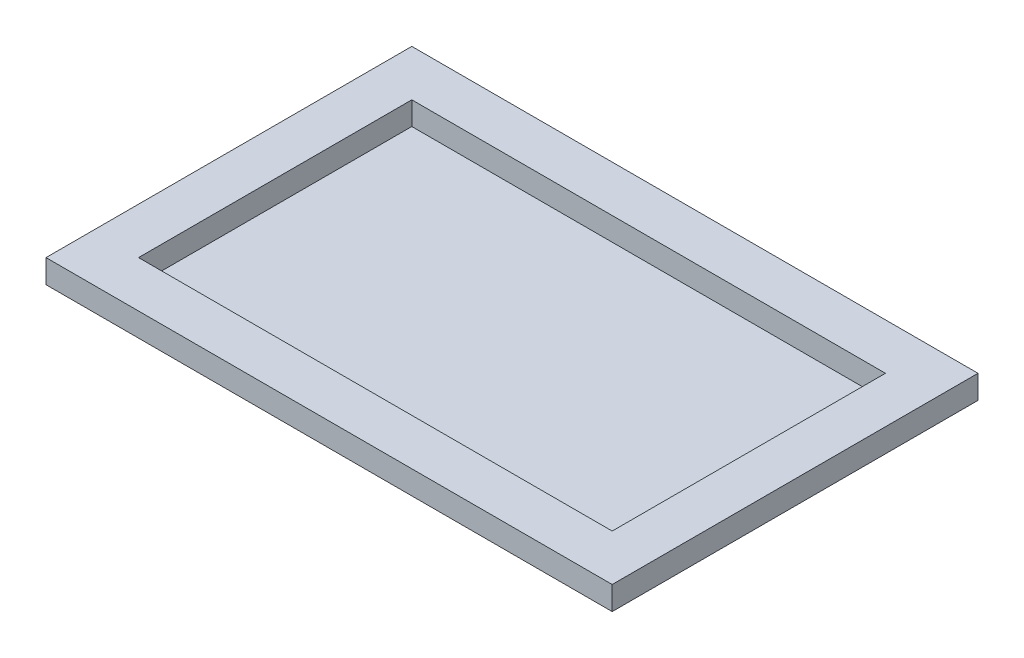
ISO-10303-21;
HEADER;
FILE_DESCRIPTION(('STEP AP214'),'2;1');
FILE_NAME('part.step','',(''),(''),'','','');
FILE_SCHEMA(('AUTOMOTIVE_DESIGN { 1 0 10303 214 1 1 1 1 }'));
ENDSEC;
DATA;
#1=APPLICATION_CONTEXT('core data for automotive mechanical design processes');
#2=APPLICATION_PROTOCOL_DEFINITION('international standard','automotive_design',2000,#1);
#3=PRODUCT_CONTEXT('',#1,'mechanical');
#4=PRODUCT('Part','Part','',(#3));
#5=PRODUCT_RELATED_PRODUCT_CATEGORY('part','',(#4));
#6=PRODUCT_DEFINITION_FORMATION('','',#4);
#7=PRODUCT_DEFINITION_CONTEXT('part definition',#1,'design');
#8=PRODUCT_DEFINITION('design','',#6,#7);
#9=PRODUCT_DEFINITION_SHAPE('','',#8);
#10=(LENGTH_UNIT() NAMED_UNIT(*) SI_UNIT(.MILLI.,.METRE.));
#11=(NAMED_UNIT(*) PLANE_ANGLE_UNIT() SI_UNIT($,.RADIAN.));
#12=(NAMED_UNIT(*) SI_UNIT($,.STERADIAN.) SOLID_ANGLE_UNIT());
#13=UNCERTAINTY_MEASURE_WITH_UNIT(LENGTH_MEASURE(1.E-05),#10,'distance_accuracy_value','');
#14=(GEOMETRIC_REPRESENTATION_CONTEXT(3) GLOBAL_UNCERTAINTY_ASSIGNED_CONTEXT((#13)) GLOBAL_UNIT_ASSIGNED_CONTEXT((#10,
#11,#12)) REPRESENTATION_CONTEXT('',''));
#15=CARTESIAN_POINT('',(0.,0.,0.));
#16=DIRECTION('',(0.,0.,1.));
#17=DIRECTION('',(1.,0.,0.));
#18=AXIS2_PLACEMENT_3D('',#15,#16,#17);
#19=CARTESIAN_POINT('',(0.,12.7,0.));
#20=DIRECTION('',(0.,1.,0.));
#21=DIRECTION('',(0.,0.,1.));
#22=AXIS2_PLACEMENT_3D('',#19,#20,#21);
#23=PLANE('',#22);
#24=DIRECTION('',(0.,0.,1.));
#25=VECTOR('',#24,1.);
#26=CARTESIAN_POINT('',(-155.4,12.7,100.4));
#27=LINE('',#26,#25);
#28=CARTESIAN_POINT('',(-155.4,12.7,-100.4));
#29=VERTEX_POINT('',#28);
#30=CARTESIAN_POINT('',(-155.4,12.7,100.4));
#31=VERTEX_POINT('',#30);
#32=EDGE_CURVE('E154',#29,#31,#27,.T.);
#33=ORIENTED_EDGE('',*,*,#32,.T.);
#34=DIRECTION('',(1.,0.,0.));
#35=VECTOR('',#34,1.);
#36=CARTESIAN_POINT('',(155.4,12.7,100.4));
#37=LINE('',#36,#35);
#38=CARTESIAN_POINT('',(155.4,12.7,100.4));
#39=VERTEX_POINT('',#38);
#40=EDGE_CURVE('E156',#31,#39,#37,.T.);
#41=ORIENTED_EDGE('',*,*,#40,.T.);
#42=DIRECTION('',(0.,0.,-1.));
#43=VECTOR('',#42,1.);
#44=CARTESIAN_POINT('',(155.4,12.7,100.4));
#45=LINE('',#44,#43);
#46=CARTESIAN_POINT('',(155.4,12.7,-100.4));
#47=VERTEX_POINT('',#46);
#48=EDGE_CURVE('E158',#39,#47,#45,.T.);
#49=ORIENTED_EDGE('',*,*,#48,.T.);
#50=DIRECTION('',(-1.,0.,0.));
#51=VECTOR('',#50,1.);
#52=CARTESIAN_POINT('',(155.4,12.7,-100.4));
#53=LINE('',#52,#51);
#54=EDGE_CURVE('E58',#47,#29,#53,.T.);
#55=ORIENTED_EDGE('',*,*,#54,.T.);
#56=EDGE_LOOP('',(#33,#41,#49,#55));
#57=FACE_BOUND('',#56,.T.);
#58=DIRECTION('',(1.,0.,0.));
#59=VECTOR('',#58,1.);
#60=CARTESIAN_POINT('',(130.,12.7,75.));
#61=LINE('',#60,#59);
#62=CARTESIAN_POINT('',(-130.,12.7,75.));
#63=VERTEX_POINT('',#62);
#64=CARTESIAN_POINT('',(130.,12.7,75.));
#65=VERTEX_POINT('',#64);
#66=EDGE_CURVE('E129',#63,#65,#61,.T.);
#67=ORIENTED_EDGE('',*,*,#66,.F.);
#68=DIRECTION('',(0.,0.,1.));
#69=VECTOR('',#68,1.);
#70=CARTESIAN_POINT('',(-130.,12.7,75.));
#71=LINE('',#70,#69);
#72=CARTESIAN_POINT('',(-130.,12.7,-75.));
#73=VERTEX_POINT('',#72);
#74=EDGE_CURVE('E127',#73,#63,#71,.T.);
#75=ORIENTED_EDGE('',*,*,#74,.F.);
#76=DIRECTION('',(-1.,0.,0.));
#77=VECTOR('',#76,1.);
#78=CARTESIAN_POINT('',(130.,12.7,-75.));
#79=LINE('',#78,#77);
#80=CARTESIAN_POINT('',(130.,12.7,-75.));
#81=VERTEX_POINT('',#80);
#82=EDGE_CURVE('E134',#81,#73,#79,.T.);
#83=ORIENTED_EDGE('',*,*,#82,.F.);
#84=DIRECTION('',(0.,0.,-1.));
#85=VECTOR('',#84,1.);
#86=CARTESIAN_POINT('',(130.,12.7,75.));
#87=LINE('',#86,#85);
#88=EDGE_CURVE('E132',#65,#81,#87,.T.);
#89=ORIENTED_EDGE('',*,*,#88,.F.);
#90=EDGE_LOOP('',(#67,#75,#83,#89));
#91=FACE_BOUND('',#90,.T.);
#92=ADVANCED_FACE('F35',(#57,#91),#23,.T.);
#93=CARTESIAN_POINT('',(-155.4,12.7,100.4));
#94=DIRECTION('',(1.,0.,0.));
#95=DIRECTION('',(0.,0.,-1.));
#96=AXIS2_PLACEMENT_3D('',#93,#94,#95);
#97=PLANE('',#96);
#98=DIRECTION('',(0.,-1.,0.));
#99=VECTOR('',#98,1.);
#100=CARTESIAN_POINT('',(-155.4,12.7,-100.4));
#101=LINE('',#100,#99);
#102=CARTESIAN_POINT('',(-155.4,-0.2,-100.4));
#103=VERTEX_POINT('',#102);
#104=EDGE_CURVE('E107',#29,#103,#101,.T.);
#105=ORIENTED_EDGE('',*,*,#104,.T.);
#106=DIRECTION('',(0.,0.,-1.));
#107=VECTOR('',#106,1.);
#108=CARTESIAN_POINT('',(-155.4,-0.2,-100.4));
#109=LINE('',#108,#107);
#110=CARTESIAN_POINT('',(-155.4,-0.2,100.4));
#111=VERTEX_POINT('',#110);
#112=EDGE_CURVE('E121',#111,#103,#109,.T.);
#113=ORIENTED_EDGE('',*,*,#112,.F.);
#114=DIRECTION('',(0.,-1.,0.));
#115=VECTOR('',#114,1.);
#116=CARTESIAN_POINT('',(-155.4,12.7,100.4));
#117=LINE('',#116,#115);
#118=EDGE_CURVE('E11',#31,#111,#117,.T.);
#119=ORIENTED_EDGE('',*,*,#118,.F.);
#120=ORIENTED_EDGE('',*,*,#32,.F.);
#121=EDGE_LOOP('',(#105,#113,#119,#120));
#122=FACE_BOUND('',#121,.T.);
#123=ADVANCED_FACE('F37',(#122),#97,.F.);
#124=CARTESIAN_POINT('',(155.4,12.7,100.4));
#125=DIRECTION('',(0.,0.,-1.));
#126=DIRECTION('',(-1.,0.,0.));
#127=AXIS2_PLACEMENT_3D('',#124,#125,#126);
#128=PLANE('',#127);
#129=ORIENTED_EDGE('',*,*,#118,.T.);
#130=DIRECTION('',(-1.,0.,0.));
#131=VECTOR('',#130,1.);
#132=CARTESIAN_POINT('',(-155.4,-0.2,100.4));
#133=LINE('',#132,#131);
#134=CARTESIAN_POINT('',(155.4,-0.2,100.4));
#135=VERTEX_POINT('',#134);
#136=EDGE_CURVE('E116',#135,#111,#133,.T.);
#137=ORIENTED_EDGE('',*,*,#136,.F.);
#138=DIRECTION('',(0.,-1.,0.));
#139=VECTOR('',#138,1.);
#140=CARTESIAN_POINT('',(155.4,12.7,100.4));
#141=LINE('',#140,#139);
#142=EDGE_CURVE('E43',#39,#135,#141,.T.);
#143=ORIENTED_EDGE('',*,*,#142,.F.);
#144=ORIENTED_EDGE('',*,*,#40,.F.);
#145=EDGE_LOOP('',(#129,#137,#143,#144));
#146=FACE_BOUND('',#145,.T.);
#147=ADVANCED_FACE('F166',(#146),#128,.F.);
#148=CARTESIAN_POINT('',(155.4,12.7,100.4));
#149=DIRECTION('',(-1.,0.,0.));
#150=DIRECTION('',(0.,0.,1.));
#151=AXIS2_PLACEMENT_3D('',#148,#149,#150);
#152=PLANE('',#151);
#153=ORIENTED_EDGE('',*,*,#142,.T.);
#154=DIRECTION('',(0.,0.,1.));
#155=VECTOR('',#154,1.);
#156=CARTESIAN_POINT('',(155.4,-0.2,100.4));
#157=LINE('',#156,#155);
#158=CARTESIAN_POINT('',(155.4,-0.2,-100.4));
#159=VERTEX_POINT('',#158);
#160=EDGE_CURVE('E110',#159,#135,#157,.T.);
#161=ORIENTED_EDGE('',*,*,#160,.F.);
#162=DIRECTION('',(0.,-1.,0.));
#163=VECTOR('',#162,1.);
#164=CARTESIAN_POINT('',(155.4,12.7,-100.4));
#165=LINE('',#164,#163);
#166=EDGE_CURVE('E100',#47,#159,#165,.T.);
#167=ORIENTED_EDGE('',*,*,#166,.F.);
#168=ORIENTED_EDGE('',*,*,#48,.F.);
#169=EDGE_LOOP('',(#153,#161,#167,#168));
#170=FACE_BOUND('',#169,.T.);
#171=ADVANCED_FACE('F111',(#170),#152,.F.);
#172=CARTESIAN_POINT('',(155.4,12.7,-100.4));
#173=DIRECTION('',(0.,0.,1.));
#174=DIRECTION('',(1.,0.,0.));
#175=AXIS2_PLACEMENT_3D('',#172,#173,#174);
#176=PLANE('',#175);
#177=ORIENTED_EDGE('',*,*,#166,.T.);
#178=DIRECTION('',(1.,0.,0.));
#179=VECTOR('',#178,1.);
#180=CARTESIAN_POINT('',(155.4,-0.2,-100.4));
#181=LINE('',#180,#179);
#182=EDGE_CURVE('E104',#103,#159,#181,.T.);
#183=ORIENTED_EDGE('',*,*,#182,.F.);
#184=ORIENTED_EDGE('',*,*,#104,.F.);
#185=ORIENTED_EDGE('',*,*,#54,.F.);
#186=EDGE_LOOP('',(#177,#183,#184,#185));
#187=FACE_BOUND('',#186,.T.);
#188=ADVANCED_FACE('F102',(#187),#176,.F.);
#189=CARTESIAN_POINT('',(-130.,12.7,75.));
#190=DIRECTION('',(1.,0.,0.));
#191=DIRECTION('',(0.,0.,-1.));
#192=AXIS2_PLACEMENT_3D('',#189,#190,#191);
#193=PLANE('',#192);
#194=DIRECTION('',(0.,0.,1.));
#195=VECTOR('',#194,1.);
#196=CARTESIAN_POINT('',(-130.,0.,75.));
#197=LINE('',#196,#195);
#198=CARTESIAN_POINT('',(-130.,0.,-75.));
#199=VERTEX_POINT('',#198);
#200=CARTESIAN_POINT('',(-130.,0.,75.));
#201=VERTEX_POINT('',#200);
#202=EDGE_CURVE('E126',#199,#201,#197,.T.);
#203=ORIENTED_EDGE('',*,*,#202,.F.);
#204=DIRECTION('',(0.,-1.,0.));
#205=VECTOR('',#204,1.);
#206=CARTESIAN_POINT('',(-130.,12.7,-75.));
#207=LINE('',#206,#205);
#208=EDGE_CURVE('E136',#73,#199,#207,.T.);
#209=ORIENTED_EDGE('',*,*,#208,.F.);
#210=ORIENTED_EDGE('',*,*,#74,.T.);
#211=DIRECTION('',(0.,-1.,0.));
#212=VECTOR('',#211,1.);
#213=CARTESIAN_POINT('',(-130.,12.7,75.));
#214=LINE('',#213,#212);
#215=EDGE_CURVE('E151',#63,#201,#214,.T.);
#216=ORIENTED_EDGE('',*,*,#215,.T.);
#217=EDGE_LOOP('',(#203,#209,#210,#216));
#218=FACE_BOUND('',#217,.T.);
#219=ADVANCED_FACE('F179',(#218),#193,.T.);
#220=CARTESIAN_POINT('',(130.,12.7,75.));
#221=DIRECTION('',(0.,0.,-1.));
#222=DIRECTION('',(-1.,0.,0.));
#223=AXIS2_PLACEMENT_3D('',#220,#221,#222);
#224=PLANE('',#223);
#225=DIRECTION('',(1.,0.,0.));
#226=VECTOR('',#225,1.);
#227=CARTESIAN_POINT('',(130.,0.,75.));
#228=LINE('',#227,#226);
#229=CARTESIAN_POINT('',(130.,0.,75.));
#230=VERTEX_POINT('',#229);
#231=EDGE_CURVE('E139',#201,#230,#228,.T.);
#232=ORIENTED_EDGE('',*,*,#231,.F.);
#233=ORIENTED_EDGE('',*,*,#215,.F.);
#234=ORIENTED_EDGE('',*,*,#66,.T.);
#235=DIRECTION('',(0.,-1.,0.));
#236=VECTOR('',#235,1.);
#237=CARTESIAN_POINT('',(130.,12.7,75.));
#238=LINE('',#237,#236);
#239=EDGE_CURVE('E149',#65,#230,#238,.T.);
#240=ORIENTED_EDGE('',*,*,#239,.T.);
#241=EDGE_LOOP('',(#232,#233,#234,#240));
#242=FACE_BOUND('',#241,.T.);
#243=ADVANCED_FACE('F185',(#242),#224,.T.);
#244=CARTESIAN_POINT('',(130.,12.7,75.));
#245=DIRECTION('',(-1.,0.,0.));
#246=DIRECTION('',(0.,0.,1.));
#247=AXIS2_PLACEMENT_3D('',#244,#245,#246);
#248=PLANE('',#247);
#249=DIRECTION('',(0.,0.,-1.));
#250=VECTOR('',#249,1.);
#251=CARTESIAN_POINT('',(130.,0.,75.));
#252=LINE('',#251,#250);
#253=CARTESIAN_POINT('',(130.,0.,-75.));
#254=VERTEX_POINT('',#253);
#255=EDGE_CURVE('E142',#230,#254,#252,.T.);
#256=ORIENTED_EDGE('',*,*,#255,.F.);
#257=ORIENTED_EDGE('',*,*,#239,.F.);
#258=ORIENTED_EDGE('',*,*,#88,.T.);
#259=DIRECTION('',(0.,-1.,0.));
#260=VECTOR('',#259,1.);
#261=CARTESIAN_POINT('',(130.,12.7,-75.));
#262=LINE('',#261,#260);
#263=EDGE_CURVE('E50',#81,#254,#262,.T.);
#264=ORIENTED_EDGE('',*,*,#263,.T.);
#265=EDGE_LOOP('',(#256,#257,#258,#264));
#266=FACE_BOUND('',#265,.T.);
#267=ADVANCED_FACE('F190',(#266),#248,.T.);
#268=CARTESIAN_POINT('',(130.,12.7,-75.));
#269=DIRECTION('',(0.,0.,1.));
#270=DIRECTION('',(1.,0.,0.));
#271=AXIS2_PLACEMENT_3D('',#268,#269,#270);
#272=PLANE('',#271);
#273=DIRECTION('',(-1.,0.,0.));
#274=VECTOR('',#273,1.);
#275=CARTESIAN_POINT('',(130.,0.,-75.));
#276=LINE('',#275,#274);
#277=EDGE_CURVE('E130',#254,#199,#276,.T.);
#278=ORIENTED_EDGE('',*,*,#277,.F.);
#279=ORIENTED_EDGE('',*,*,#263,.F.);
#280=ORIENTED_EDGE('',*,*,#82,.T.);
#281=ORIENTED_EDGE('',*,*,#208,.T.);
#282=EDGE_LOOP('',(#278,#279,#280,#281));
#283=FACE_BOUND('',#282,.T.);
#284=ADVANCED_FACE('F199',(#283),#272,.T.);
#285=CARTESIAN_POINT('',(0.,0.,0.));
#286=DIRECTION('',(0.,1.,0.));
#287=DIRECTION('',(0.,0.,1.));
#288=AXIS2_PLACEMENT_3D('',#285,#286,#287);
#289=PLANE('',#288);
#290=ORIENTED_EDGE('',*,*,#277,.T.);
#291=ORIENTED_EDGE('',*,*,#202,.T.);
#292=ORIENTED_EDGE('',*,*,#231,.T.);
#293=ORIENTED_EDGE('',*,*,#255,.T.);
#294=EDGE_LOOP('',(#290,#291,#292,#293));
#295=FACE_BOUND('',#294,.T.);
#296=ADVANCED_FACE('F197',(#295),#289,.T.);
#297=CARTESIAN_POINT('',(0.,-0.2,0.));
#298=DIRECTION('',(0.,1.,0.));
#299=DIRECTION('',(0.,0.,1.));
#300=AXIS2_PLACEMENT_3D('',#297,#298,#299);
#301=PLANE('',#300);
#302=ORIENTED_EDGE('',*,*,#182,.T.);
#303=ORIENTED_EDGE('',*,*,#160,.T.);
#304=ORIENTED_EDGE('',*,*,#136,.T.);
#305=ORIENTED_EDGE('',*,*,#112,.T.);
#306=EDGE_LOOP('',(#302,#303,#304,#305));
#307=FACE_BOUND('',#306,.T.);
#308=ADVANCED_FACE('F119',(#307),#301,.F.);
#309=CLOSED_SHELL('',(#92,#123,#147,#171,#188,#219,#243,#267,#284,#296,#308));
#310=MANIFOLD_SOLID_BREP('B2',#309);
#311=ADVANCED_BREP_SHAPE_REPRESENTATION('',(#18,#310),#14);
#312=SHAPE_DEFINITION_REPRESENTATION(#9,#311);
ENDSEC;
END-ISO-10303-21;
